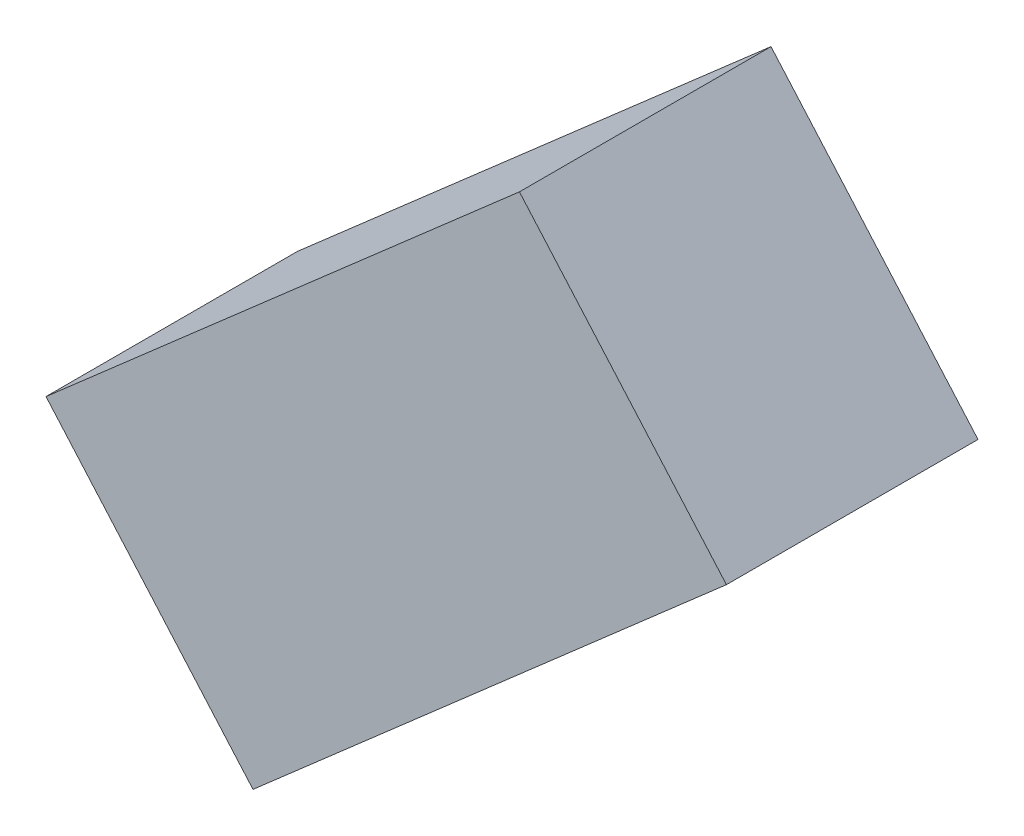
ISO-10303-21;
HEADER;
FILE_DESCRIPTION(('STEP AP214'),'2;1');
FILE_NAME('part.step','',(''),(''),'','','');
FILE_SCHEMA(('AUTOMOTIVE_DESIGN { 1 0 10303 214 1 1 1 1 }'));
ENDSEC;
DATA;
#1=APPLICATION_CONTEXT('core data for automotive mechanical design processes');
#2=APPLICATION_PROTOCOL_DEFINITION('international standard','automotive_design',2000,#1);
#3=PRODUCT_CONTEXT('',#1,'mechanical');
#4=PRODUCT('Part','Part','',(#3));
#5=PRODUCT_RELATED_PRODUCT_CATEGORY('part','',(#4));
#6=PRODUCT_DEFINITION_FORMATION('','',#4);
#7=PRODUCT_DEFINITION_CONTEXT('part definition',#1,'design');
#8=PRODUCT_DEFINITION('design','',#6,#7);
#9=PRODUCT_DEFINITION_SHAPE('','',#8);
#10=(LENGTH_UNIT() NAMED_UNIT(*) SI_UNIT(.MILLI.,.METRE.));
#11=(NAMED_UNIT(*) PLANE_ANGLE_UNIT() SI_UNIT($,.RADIAN.));
#12=(NAMED_UNIT(*) SI_UNIT($,.STERADIAN.) SOLID_ANGLE_UNIT());
#13=UNCERTAINTY_MEASURE_WITH_UNIT(LENGTH_MEASURE(1.E-05),#10,'distance_accuracy_value','');
#14=(GEOMETRIC_REPRESENTATION_CONTEXT(3) GLOBAL_UNCERTAINTY_ASSIGNED_CONTEXT((#13)) GLOBAL_UNIT_ASSIGNED_CONTEXT((#10,
#11,#12)) REPRESENTATION_CONTEXT('',''));
#15=CARTESIAN_POINT('',(0.,0.,0.));
#16=DIRECTION('',(0.,0.,1.));
#17=DIRECTION('',(1.,0.,0.));
#18=AXIS2_PLACEMENT_3D('',#15,#16,#17);
#19=CARTESIAN_POINT('',(-43.2095820089942,61.3861919409121,8.));
#20=DIRECTION('',(-0.752788471223424,-0.658262499002564,0.));
#21=DIRECTION('',(0.658262499002564,-0.752788471223424,0.));
#22=AXIS2_PLACEMENT_3D('',#19,#20,#21);
#23=PLANE('',#22);
#24=DIRECTION('',(-0.658262499002564,0.752788471223424,0.));
#25=VECTOR('',#24,1.);
#26=CARTESIAN_POINT('',(-43.2095820089942,61.3861919409121,0.));
#27=LINE('',#26,#25);
#28=CARTESIAN_POINT('',(-43.2095820089942,61.3861919409121,0.));
#29=VERTEX_POINT('',#28);
#30=CARTESIAN_POINT('',(-49.7922069990198,68.9140766531464,0.));
#31=VERTEX_POINT('',#30);
#32=EDGE_CURVE('E100',#29,#31,#27,.T.);
#33=ORIENTED_EDGE('',*,*,#32,.T.);
#34=DIRECTION('',(0.,0.,-1.));
#35=VECTOR('',#34,1.);
#36=CARTESIAN_POINT('',(-49.7922069990198,68.9140766531464,8.));
#37=LINE('',#36,#35);
#38=CARTESIAN_POINT('',(-49.7922069990198,68.9140766531464,8.));
#39=VERTEX_POINT('',#38);
#40=EDGE_CURVE('E11',#39,#31,#37,.T.);
#41=ORIENTED_EDGE('',*,*,#40,.F.);
#42=DIRECTION('',(-0.658262499002564,0.752788471223424,0.));
#43=VECTOR('',#42,1.);
#44=CARTESIAN_POINT('',(-43.2095820089942,61.3861919409121,8.));
#45=LINE('',#44,#43);
#46=CARTESIAN_POINT('',(-43.2095820089942,61.3861919409121,8.));
#47=VERTEX_POINT('',#46);
#48=EDGE_CURVE('E88',#47,#39,#45,.T.);
#49=ORIENTED_EDGE('',*,*,#48,.F.);
#50=DIRECTION('',(0.,0.,-1.));
#51=VECTOR('',#50,1.);
#52=CARTESIAN_POINT('',(-43.2095820089942,61.3861919409121,8.));
#53=LINE('',#52,#51);
#54=EDGE_CURVE('E96',#47,#29,#53,.T.);
#55=ORIENTED_EDGE('',*,*,#54,.T.);
#56=EDGE_LOOP('',(#33,#41,#49,#55));
#57=FACE_BOUND('',#56,.T.);
#58=ADVANCED_FACE('F37',(#57),#23,.F.);
#59=CARTESIAN_POINT('',(-49.7922069990198,68.9140766531464,8.));
#60=DIRECTION('',(0.658262499002564,-0.752788471223424,0.));
#61=DIRECTION('',(0.752788471223424,0.658262499002564,0.));
#62=AXIS2_PLACEMENT_3D('',#59,#60,#61);
#63=PLANE('',#62);
#64=DIRECTION('',(-0.752788471223424,-0.658262499002564,0.));
#65=VECTOR('',#64,1.);
#66=CARTESIAN_POINT('',(-49.7922069990198,68.9140766531464,0.));
#67=LINE('',#66,#65);
#68=CARTESIAN_POINT('',(-64.8479764234883,55.7488266730951,0.));
#69=VERTEX_POINT('',#68);
#70=EDGE_CURVE('E92',#31,#69,#67,.T.);
#71=ORIENTED_EDGE('',*,*,#70,.T.);
#72=DIRECTION('',(0.,0.,-1.));
#73=VECTOR('',#72,1.);
#74=CARTESIAN_POINT('',(-64.8479764234883,55.7488266730951,8.));
#75=LINE('',#74,#73);
#76=CARTESIAN_POINT('',(-64.8479764234883,55.7488266730951,8.));
#77=VERTEX_POINT('',#76);
#78=EDGE_CURVE('E45',#77,#69,#75,.T.);
#79=ORIENTED_EDGE('',*,*,#78,.F.);
#80=DIRECTION('',(-0.752788471223424,-0.658262499002564,0.));
#81=VECTOR('',#80,1.);
#82=CARTESIAN_POINT('',(-49.7922069990198,68.9140766531464,8.));
#83=LINE('',#82,#81);
#84=EDGE_CURVE('E83',#39,#77,#83,.T.);
#85=ORIENTED_EDGE('',*,*,#84,.F.);
#86=ORIENTED_EDGE('',*,*,#40,.T.);
#87=EDGE_LOOP('',(#71,#79,#85,#86));
#88=FACE_BOUND('',#87,.T.);
#89=ADVANCED_FACE('F91',(#88),#63,.F.);
#90=CARTESIAN_POINT('',(-64.8479764234883,55.7488266730951,8.));
#91=DIRECTION('',(0.752788471223426,0.658262499002561,0.));
#92=DIRECTION('',(-0.658262499002561,0.752788471223426,0.));
#93=AXIS2_PLACEMENT_3D('',#90,#91,#92);
#94=PLANE('',#93);
#95=DIRECTION('',(0.658262499002561,-0.752788471223426,0.));
#96=VECTOR('',#95,1.);
#97=CARTESIAN_POINT('',(-64.8479764234883,55.7488266730951,0.));
#98=LINE('',#97,#96);
#99=CARTESIAN_POINT('',(-58.2653514334627,48.2209419608609,0.));
#100=VERTEX_POINT('',#99);
#101=EDGE_CURVE('E70',#69,#100,#98,.T.);
#102=ORIENTED_EDGE('',*,*,#101,.T.);
#103=DIRECTION('',(0.,0.,-1.));
#104=VECTOR('',#103,1.);
#105=CARTESIAN_POINT('',(-58.2653514334627,48.2209419608609,8.));
#106=LINE('',#105,#104);
#107=CARTESIAN_POINT('',(-58.2653514334627,48.2209419608609,8.));
#108=VERTEX_POINT('',#107);
#109=EDGE_CURVE('E93',#108,#100,#106,.T.);
#110=ORIENTED_EDGE('',*,*,#109,.F.);
#111=DIRECTION('',(0.658262499002561,-0.752788471223426,0.));
#112=VECTOR('',#111,1.);
#113=CARTESIAN_POINT('',(-64.8479764234883,55.7488266730951,8.));
#114=LINE('',#113,#112);
#115=EDGE_CURVE('E86',#77,#108,#114,.T.);
#116=ORIENTED_EDGE('',*,*,#115,.F.);
#117=ORIENTED_EDGE('',*,*,#78,.T.);
#118=EDGE_LOOP('',(#102,#110,#116,#117));
#119=FACE_BOUND('',#118,.T.);
#120=ADVANCED_FACE('F94',(#119),#94,.F.);
#121=CARTESIAN_POINT('',(-58.2653514334627,48.2209419608609,8.));
#122=DIRECTION('',(-0.658262499002562,0.752788471223426,0.));
#123=DIRECTION('',(-0.752788471223426,-0.658262499002562,0.));
#124=AXIS2_PLACEMENT_3D('',#121,#122,#123);
#125=PLANE('',#124);
#126=DIRECTION('',(0.752788471223426,0.658262499002562,0.));
#127=VECTOR('',#126,1.);
#128=CARTESIAN_POINT('',(-58.2653514334627,48.2209419608609,0.));
#129=LINE('',#128,#127);
#130=EDGE_CURVE('E76',#100,#29,#129,.T.);
#131=ORIENTED_EDGE('',*,*,#130,.T.);
#132=ORIENTED_EDGE('',*,*,#54,.F.);
#133=DIRECTION('',(0.752788471223426,0.658262499002562,0.));
#134=VECTOR('',#133,1.);
#135=CARTESIAN_POINT('',(-58.2653514334627,48.2209419608609,8.));
#136=LINE('',#135,#134);
#137=EDGE_CURVE('E53',#108,#47,#136,.T.);
#138=ORIENTED_EDGE('',*,*,#137,.F.);
#139=ORIENTED_EDGE('',*,*,#109,.T.);
#140=EDGE_LOOP('',(#131,#132,#138,#139));
#141=FACE_BOUND('',#140,.T.);
#142=ADVANCED_FACE('F107',(#141),#125,.F.);
#143=CARTESIAN_POINT('',(0.,0.,8.));
#144=DIRECTION('',(0.,0.,1.));
#145=DIRECTION('',(1.,0.,0.));
#146=AXIS2_PLACEMENT_3D('',#143,#144,#145);
#147=PLANE('',#146);
#148=ORIENTED_EDGE('',*,*,#48,.T.);
#149=ORIENTED_EDGE('',*,*,#84,.T.);
#150=ORIENTED_EDGE('',*,*,#115,.T.);
#151=ORIENTED_EDGE('',*,*,#137,.T.);
#152=EDGE_LOOP('',(#148,#149,#150,#151));
#153=FACE_BOUND('',#152,.T.);
#154=ADVANCED_FACE('F84',(#153),#147,.T.);
#155=CARTESIAN_POINT('',(0.,0.,0.));
#156=DIRECTION('',(0.,0.,1.));
#157=DIRECTION('',(1.,0.,0.));
#158=AXIS2_PLACEMENT_3D('',#155,#156,#157);
#159=PLANE('',#158);
#160=ORIENTED_EDGE('',*,*,#32,.F.);
#161=ORIENTED_EDGE('',*,*,#130,.F.);
#162=ORIENTED_EDGE('',*,*,#101,.F.);
#163=ORIENTED_EDGE('',*,*,#70,.F.);
#164=EDGE_LOOP('',(#160,#161,#162,#163));
#165=FACE_BOUND('',#164,.T.);
#166=ADVANCED_FACE('F110',(#165),#159,.F.);
#167=CLOSED_SHELL('',(#58,#89,#120,#142,#154,#166));
#168=MANIFOLD_SOLID_BREP('B2',#167);
#169=ADVANCED_BREP_SHAPE_REPRESENTATION('',(#18,#168),#14);
#170=SHAPE_DEFINITION_REPRESENTATION(#9,#169);
ENDSEC;
END-ISO-10303-21;
